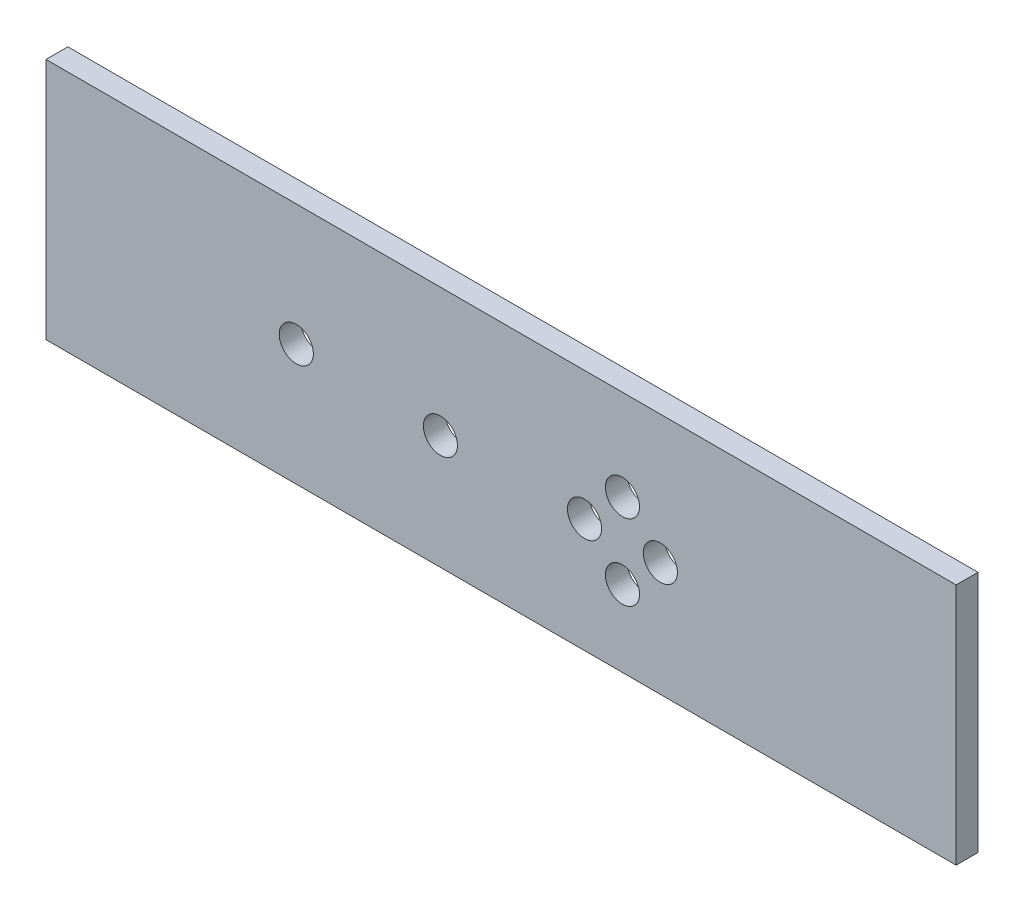
ISO-10303-21;
HEADER;
FILE_DESCRIPTION(('STEP AP214'),'2;1');
FILE_NAME('part.step','',(''),(''),'','','');
FILE_SCHEMA(('AUTOMOTIVE_DESIGN { 1 0 10303 214 1 1 1 1 }'));
ENDSEC;
DATA;
#1=APPLICATION_CONTEXT('core data for automotive mechanical design processes');
#2=APPLICATION_PROTOCOL_DEFINITION('international standard','automotive_design',2000,#1);
#3=PRODUCT_CONTEXT('',#1,'mechanical');
#4=PRODUCT('Part','Part','',(#3));
#5=PRODUCT_RELATED_PRODUCT_CATEGORY('part','',(#4));
#6=PRODUCT_DEFINITION_FORMATION('','',#4);
#7=PRODUCT_DEFINITION_CONTEXT('part definition',#1,'design');
#8=PRODUCT_DEFINITION('design','',#6,#7);
#9=PRODUCT_DEFINITION_SHAPE('','',#8);
#10=(LENGTH_UNIT() NAMED_UNIT(*) SI_UNIT(.MILLI.,.METRE.));
#11=(NAMED_UNIT(*) PLANE_ANGLE_UNIT() SI_UNIT($,.RADIAN.));
#12=(NAMED_UNIT(*) SI_UNIT($,.STERADIAN.) SOLID_ANGLE_UNIT());
#13=UNCERTAINTY_MEASURE_WITH_UNIT(LENGTH_MEASURE(1.E-05),#10,'distance_accuracy_value','');
#14=(GEOMETRIC_REPRESENTATION_CONTEXT(3) GLOBAL_UNCERTAINTY_ASSIGNED_CONTEXT((#13)) GLOBAL_UNIT_ASSIGNED_CONTEXT((#10,
#11,#12)) REPRESENTATION_CONTEXT('',''));
#15=CARTESIAN_POINT('',(0.,0.,0.));
#16=DIRECTION('',(0.,0.,1.));
#17=DIRECTION('',(1.,0.,0.));
#18=AXIS2_PLACEMENT_3D('',#15,#16,#17);
#19=CARTESIAN_POINT('',(-322.443113772455,234.22754491018,18.288));
#20=DIRECTION('',(1.,0.,0.));
#21=DIRECTION('',(0.,0.,-1.));
#22=AXIS2_PLACEMENT_3D('',#19,#20,#21);
#23=PLANE('',#22);
#24=DIRECTION('',(0.,-1.,0.));
#25=VECTOR('',#24,1.);
#26=CARTESIAN_POINT('',(-322.443113772455,234.22754491018,0.));
#27=LINE('',#26,#25);
#28=CARTESIAN_POINT('',(-322.443113772455,234.22754491018,0.));
#29=VERTEX_POINT('',#28);
#30=CARTESIAN_POINT('',(-322.443113772455,31.0275449101796,0.));
#31=VERTEX_POINT('',#30);
#32=EDGE_CURVE('E100',#29,#31,#27,.T.);
#33=ORIENTED_EDGE('',*,*,#32,.T.);
#34=DIRECTION('',(0.,0.,-1.));
#35=VECTOR('',#34,1.);
#36=CARTESIAN_POINT('',(-322.443113772455,31.0275449101796,18.288));
#37=LINE('',#36,#35);
#38=CARTESIAN_POINT('',(-322.443113772455,31.0275449101796,18.288));
#39=VERTEX_POINT('',#38);
#40=EDGE_CURVE('E11',#39,#31,#37,.T.);
#41=ORIENTED_EDGE('',*,*,#40,.F.);
#42=DIRECTION('',(0.,-1.,0.));
#43=VECTOR('',#42,1.);
#44=CARTESIAN_POINT('',(-322.443113772455,234.22754491018,18.288));
#45=LINE('',#44,#43);
#46=CARTESIAN_POINT('',(-322.443113772455,234.22754491018,18.288));
#47=VERTEX_POINT('',#46);
#48=EDGE_CURVE('E88',#47,#39,#45,.T.);
#49=ORIENTED_EDGE('',*,*,#48,.F.);
#50=DIRECTION('',(0.,0.,-1.));
#51=VECTOR('',#50,1.);
#52=CARTESIAN_POINT('',(-322.443113772455,234.22754491018,18.288));
#53=LINE('',#52,#51);
#54=EDGE_CURVE('E96',#47,#29,#53,.T.);
#55=ORIENTED_EDGE('',*,*,#54,.T.);
#56=EDGE_LOOP('',(#33,#41,#49,#55));
#57=FACE_BOUND('',#56,.T.);
#58=ADVANCED_FACE('F37',(#57),#23,.F.);
#59=CARTESIAN_POINT('',(-322.443113772455,31.0275449101796,18.288));
#60=DIRECTION('',(0.,1.,0.));
#61=DIRECTION('',(0.,0.,1.));
#62=AXIS2_PLACEMENT_3D('',#59,#60,#61);
#63=PLANE('',#62);
#64=DIRECTION('',(1.,0.,0.));
#65=VECTOR('',#64,1.);
#66=CARTESIAN_POINT('',(-322.443113772455,31.0275449101796,0.));
#67=LINE('',#66,#65);
#68=CARTESIAN_POINT('',(439.556886227545,31.0275449101796,0.));
#69=VERTEX_POINT('',#68);
#70=EDGE_CURVE('E92',#31,#69,#67,.T.);
#71=ORIENTED_EDGE('',*,*,#70,.T.);
#72=DIRECTION('',(0.,0.,-1.));
#73=VECTOR('',#72,1.);
#74=CARTESIAN_POINT('',(439.556886227545,31.0275449101796,18.288));
#75=LINE('',#74,#73);
#76=CARTESIAN_POINT('',(439.556886227545,31.0275449101796,18.288));
#77=VERTEX_POINT('',#76);
#78=EDGE_CURVE('E45',#77,#69,#75,.T.);
#79=ORIENTED_EDGE('',*,*,#78,.F.);
#80=DIRECTION('',(1.,0.,0.));
#81=VECTOR('',#80,1.);
#82=CARTESIAN_POINT('',(-322.443113772455,31.0275449101796,18.288));
#83=LINE('',#82,#81);
#84=EDGE_CURVE('E83',#39,#77,#83,.T.);
#85=ORIENTED_EDGE('',*,*,#84,.F.);
#86=ORIENTED_EDGE('',*,*,#40,.T.);
#87=EDGE_LOOP('',(#71,#79,#85,#86));
#88=FACE_BOUND('',#87,.T.);
#89=ADVANCED_FACE('F91',(#88),#63,.F.);
#90=CARTESIAN_POINT('',(439.556886227545,234.22754491018,18.288));
#91=DIRECTION('',(-1.,0.,0.));
#92=DIRECTION('',(0.,-1.,0.));
#93=AXIS2_PLACEMENT_3D('',#90,#91,#92);
#94=PLANE('',#93);
#95=DIRECTION('',(0.,1.,0.));
#96=VECTOR('',#95,1.);
#97=CARTESIAN_POINT('',(439.556886227545,234.22754491018,0.));
#98=LINE('',#97,#96);
#99=CARTESIAN_POINT('',(439.556886227545,234.22754491018,0.));
#100=VERTEX_POINT('',#99);
#101=EDGE_CURVE('E70',#69,#100,#98,.T.);
#102=ORIENTED_EDGE('',*,*,#101,.T.);
#103=DIRECTION('',(0.,0.,-1.));
#104=VECTOR('',#103,1.);
#105=CARTESIAN_POINT('',(439.556886227545,234.22754491018,18.288));
#106=LINE('',#105,#104);
#107=CARTESIAN_POINT('',(439.556886227545,234.22754491018,18.288));
#108=VERTEX_POINT('',#107);
#109=EDGE_CURVE('E93',#108,#100,#106,.T.);
#110=ORIENTED_EDGE('',*,*,#109,.F.);
#111=DIRECTION('',(0.,1.,0.));
#112=VECTOR('',#111,1.);
#113=CARTESIAN_POINT('',(439.556886227545,234.22754491018,18.288));
#114=LINE('',#113,#112);
#115=EDGE_CURVE('E86',#77,#108,#114,.T.);
#116=ORIENTED_EDGE('',*,*,#115,.F.);
#117=ORIENTED_EDGE('',*,*,#78,.T.);
#118=EDGE_LOOP('',(#102,#110,#116,#117));
#119=FACE_BOUND('',#118,.T.);
#120=ADVANCED_FACE('F94',(#119),#94,.F.);
#121=CARTESIAN_POINT('',(-322.443113772455,234.22754491018,18.288));
#122=DIRECTION('',(0.,-1.,0.));
#123=DIRECTION('',(0.,0.,-1.));
#124=AXIS2_PLACEMENT_3D('',#121,#122,#123);
#125=PLANE('',#124);
#126=DIRECTION('',(-1.,0.,0.));
#127=VECTOR('',#126,1.);
#128=CARTESIAN_POINT('',(-322.443113772455,234.22754491018,0.));
#129=LINE('',#128,#127);
#130=EDGE_CURVE('E76',#100,#29,#129,.T.);
#131=ORIENTED_EDGE('',*,*,#130,.T.);
#132=ORIENTED_EDGE('',*,*,#54,.F.);
#133=DIRECTION('',(-1.,0.,0.));
#134=VECTOR('',#133,1.);
#135=CARTESIAN_POINT('',(-322.443113772455,234.22754491018,18.288));
#136=LINE('',#135,#134);
#137=EDGE_CURVE('E53',#108,#47,#136,.T.);
#138=ORIENTED_EDGE('',*,*,#137,.F.);
#139=ORIENTED_EDGE('',*,*,#109,.T.);
#140=EDGE_LOOP('',(#131,#132,#138,#139));
#141=FACE_BOUND('',#140,.T.);
#142=ADVANCED_FACE('F108',(#141),#125,.F.);
#143=CARTESIAN_POINT('',(0.,0.,18.288));
#144=DIRECTION('',(0.,0.,1.));
#145=DIRECTION('',(1.,0.,0.));
#146=AXIS2_PLACEMENT_3D('',#143,#144,#145);
#147=PLANE('',#146);
#148=CARTESIAN_POINT('',(191.906886227545,126.576648331846,18.288));
#149=DIRECTION('',(0.,0.,-1.));
#150=DIRECTION('',(-1.,0.,0.));
#151=AXIS2_PLACEMENT_3D('',#148,#149,#150);
#152=CIRCLE('',#151,14.2875);
#153=CARTESIAN_POINT('',(177.619386227545,126.576648331846,18.288));
#154=VERTEX_POINT('',#153);
#155=EDGE_CURVE('E123',#154,#154,#152,.T.);
#156=ORIENTED_EDGE('',*,*,#155,.T.);
#157=EDGE_LOOP('',(#156));
#158=FACE_BOUND('',#157,.T.);
#159=CARTESIAN_POINT('',(160.156886227545,158.326648331846,18.288));
#160=DIRECTION('',(0.,0.,-1.));
#161=DIRECTION('',(-1.,0.,0.));
#162=AXIS2_PLACEMENT_3D('',#159,#160,#161);
#163=CIRCLE('',#162,14.2875);
#164=CARTESIAN_POINT('',(145.869386227545,158.326648331846,18.288));
#165=VERTEX_POINT('',#164);
#166=EDGE_CURVE('E129',#165,#165,#163,.T.);
#167=ORIENTED_EDGE('',*,*,#166,.T.);
#168=EDGE_LOOP('',(#167));
#169=FACE_BOUND('',#168,.T.);
#170=CARTESIAN_POINT('',(160.156886227545,94.8266483318463,18.288));
#171=DIRECTION('',(0.,0.,-1.));
#172=DIRECTION('',(-1.,0.,0.));
#173=AXIS2_PLACEMENT_3D('',#170,#171,#172);
#174=CIRCLE('',#173,14.2875);
#175=CARTESIAN_POINT('',(145.869386227545,94.8266483318463,18.288));
#176=VERTEX_POINT('',#175);
#177=EDGE_CURVE('E130',#176,#176,#174,.T.);
#178=ORIENTED_EDGE('',*,*,#177,.T.);
#179=EDGE_LOOP('',(#178));
#180=FACE_BOUND('',#179,.T.);
#181=CARTESIAN_POINT('',(7.75688622754495,126.576648331846,18.288));
#182=DIRECTION('',(0.,0.,-1.));
#183=DIRECTION('',(-1.,0.,0.));
#184=AXIS2_PLACEMENT_3D('',#181,#182,#183);
#185=CIRCLE('',#184,14.2875);
#186=CARTESIAN_POINT('',(-6.53061377245506,126.576648331846,18.288));
#187=VERTEX_POINT('',#186);
#188=EDGE_CURVE('E141',#187,#187,#185,.T.);
#189=ORIENTED_EDGE('',*,*,#188,.T.);
#190=EDGE_LOOP('',(#189));
#191=FACE_BOUND('',#190,.T.);
#192=CARTESIAN_POINT('',(128.406886227545,126.576648331846,18.288));
#193=DIRECTION('',(0.,0.,-1.));
#194=DIRECTION('',(-1.,0.,0.));
#195=AXIS2_PLACEMENT_3D('',#192,#193,#194);
#196=CIRCLE('',#195,14.2875);
#197=CARTESIAN_POINT('',(114.119386227545,126.576648331846,18.288));
#198=VERTEX_POINT('',#197);
#199=EDGE_CURVE('E117',#198,#198,#196,.T.);
#200=ORIENTED_EDGE('',*,*,#199,.T.);
#201=EDGE_LOOP('',(#200));
#202=FACE_BOUND('',#201,.T.);
#203=CARTESIAN_POINT('',(-112.893113772455,132.62754491018,18.288));
#204=DIRECTION('',(0.,0.,-1.));
#205=DIRECTION('',(-1.,0.,0.));
#206=AXIS2_PLACEMENT_3D('',#203,#204,#205);
#207=CIRCLE('',#206,14.2875);
#208=CARTESIAN_POINT('',(-127.180613772455,132.62754491018,18.288));
#209=VERTEX_POINT('',#208);
#210=EDGE_CURVE('E103',#209,#209,#207,.T.);
#211=ORIENTED_EDGE('',*,*,#210,.T.);
#212=EDGE_LOOP('',(#211));
#213=FACE_BOUND('',#212,.T.);
#214=ORIENTED_EDGE('',*,*,#48,.T.);
#215=ORIENTED_EDGE('',*,*,#84,.T.);
#216=ORIENTED_EDGE('',*,*,#115,.T.);
#217=ORIENTED_EDGE('',*,*,#137,.T.);
#218=EDGE_LOOP('',(#214,#215,#216,#217));
#219=FACE_BOUND('',#218,.T.);
#220=ADVANCED_FACE('F84',(#158,#169,#180,#191,#202,#213,#219),#147,.T.);
#221=CARTESIAN_POINT('',(0.,0.,0.));
#222=DIRECTION('',(0.,0.,1.));
#223=DIRECTION('',(1.,0.,0.));
#224=AXIS2_PLACEMENT_3D('',#221,#222,#223);
#225=PLANE('',#224);
#226=CARTESIAN_POINT('',(191.906886227545,126.576648331846,0.));
#227=DIRECTION('',(0.,0.,-1.));
#228=DIRECTION('',(-1.,0.,0.));
#229=AXIS2_PLACEMENT_3D('',#226,#227,#228);
#230=CIRCLE('',#229,14.2875);
#231=CARTESIAN_POINT('',(177.619386227545,126.576648331846,0.));
#232=VERTEX_POINT('',#231);
#233=EDGE_CURVE('E133',#232,#232,#230,.T.);
#234=ORIENTED_EDGE('',*,*,#233,.F.);
#235=EDGE_LOOP('',(#234));
#236=FACE_BOUND('',#235,.T.);
#237=CARTESIAN_POINT('',(160.156886227545,158.326648331846,0.));
#238=DIRECTION('',(0.,0.,-1.));
#239=DIRECTION('',(-1.,0.,0.));
#240=AXIS2_PLACEMENT_3D('',#237,#238,#239);
#241=CIRCLE('',#240,14.2875);
#242=CARTESIAN_POINT('',(145.869386227545,158.326648331846,0.));
#243=VERTEX_POINT('',#242);
#244=EDGE_CURVE('E126',#243,#243,#241,.T.);
#245=ORIENTED_EDGE('',*,*,#244,.F.);
#246=EDGE_LOOP('',(#245));
#247=FACE_BOUND('',#246,.T.);
#248=CARTESIAN_POINT('',(160.156886227545,94.8266483318463,0.));
#249=DIRECTION('',(0.,0.,-1.));
#250=DIRECTION('',(-1.,0.,0.));
#251=AXIS2_PLACEMENT_3D('',#248,#249,#250);
#252=CIRCLE('',#251,14.2875);
#253=CARTESIAN_POINT('',(145.869386227545,94.8266483318463,0.));
#254=VERTEX_POINT('',#253);
#255=EDGE_CURVE('E144',#254,#254,#252,.T.);
#256=ORIENTED_EDGE('',*,*,#255,.F.);
#257=EDGE_LOOP('',(#256));
#258=FACE_BOUND('',#257,.T.);
#259=CARTESIAN_POINT('',(7.75688622754495,126.576648331846,0.));
#260=DIRECTION('',(0.,0.,-1.));
#261=DIRECTION('',(-1.,0.,0.));
#262=AXIS2_PLACEMENT_3D('',#259,#260,#261);
#263=CIRCLE('',#262,14.2875);
#264=CARTESIAN_POINT('',(-6.53061377245506,126.576648331846,0.));
#265=VERTEX_POINT('',#264);
#266=EDGE_CURVE('E138',#265,#265,#263,.T.);
#267=ORIENTED_EDGE('',*,*,#266,.F.);
#268=EDGE_LOOP('',(#267));
#269=FACE_BOUND('',#268,.T.);
#270=CARTESIAN_POINT('',(128.406886227545,126.576648331846,0.));
#271=DIRECTION('',(0.,0.,-1.));
#272=DIRECTION('',(-1.,0.,0.));
#273=AXIS2_PLACEMENT_3D('',#270,#271,#272);
#274=CIRCLE('',#273,14.2875);
#275=CARTESIAN_POINT('',(114.119386227545,126.576648331846,0.));
#276=VERTEX_POINT('',#275);
#277=EDGE_CURVE('E120',#276,#276,#274,.T.);
#278=ORIENTED_EDGE('',*,*,#277,.F.);
#279=EDGE_LOOP('',(#278));
#280=FACE_BOUND('',#279,.T.);
#281=CARTESIAN_POINT('',(-112.893113772455,132.62754491018,0.));
#282=DIRECTION('',(0.,0.,-1.));
#283=DIRECTION('',(-1.,0.,0.));
#284=AXIS2_PLACEMENT_3D('',#281,#282,#283);
#285=CIRCLE('',#284,14.2875);
#286=CARTESIAN_POINT('',(-127.180613772455,132.62754491018,0.));
#287=VERTEX_POINT('',#286);
#288=EDGE_CURVE('E114',#287,#287,#285,.T.);
#289=ORIENTED_EDGE('',*,*,#288,.F.);
#290=EDGE_LOOP('',(#289));
#291=FACE_BOUND('',#290,.T.);
#292=ORIENTED_EDGE('',*,*,#32,.F.);
#293=ORIENTED_EDGE('',*,*,#130,.F.);
#294=ORIENTED_EDGE('',*,*,#101,.F.);
#295=ORIENTED_EDGE('',*,*,#70,.F.);
#296=EDGE_LOOP('',(#292,#293,#294,#295));
#297=FACE_BOUND('',#296,.T.);
#298=ADVANCED_FACE('F111',(#236,#247,#258,#269,#280,#291,#297),#225,.F.);
#299=CARTESIAN_POINT('',(-112.893113772455,132.62754491018,18.288));
#300=DIRECTION('',(0.,0.,-1.));
#301=DIRECTION('',(-1.,0.,0.));
#302=AXIS2_PLACEMENT_3D('',#299,#300,#301);
#303=CYLINDRICAL_SURFACE('',#302,14.2875);
#304=ORIENTED_EDGE('',*,*,#210,.F.);
#305=EDGE_LOOP('',(#304));
#306=FACE_BOUND('',#305,.T.);
#307=ORIENTED_EDGE('',*,*,#288,.T.);
#308=EDGE_LOOP('',(#307));
#309=FACE_BOUND('',#308,.T.);
#310=ADVANCED_FACE('F162',(#306,#309),#303,.F.);
#311=CARTESIAN_POINT('',(128.406886227545,126.576648331846,18.288));
#312=DIRECTION('',(0.,0.,-1.));
#313=DIRECTION('',(-1.,0.,0.));
#314=AXIS2_PLACEMENT_3D('',#311,#312,#313);
#315=CYLINDRICAL_SURFACE('',#314,14.2875);
#316=ORIENTED_EDGE('',*,*,#199,.F.);
#317=EDGE_LOOP('',(#316));
#318=FACE_BOUND('',#317,.T.);
#319=ORIENTED_EDGE('',*,*,#277,.T.);
#320=EDGE_LOOP('',(#319));
#321=FACE_BOUND('',#320,.T.);
#322=ADVANCED_FACE('F172',(#318,#321),#315,.F.);
#323=CARTESIAN_POINT('',(7.75688622754495,126.576648331846,18.288));
#324=DIRECTION('',(0.,0.,-1.));
#325=DIRECTION('',(-1.,0.,0.));
#326=AXIS2_PLACEMENT_3D('',#323,#324,#325);
#327=CYLINDRICAL_SURFACE('',#326,14.2875);
#328=ORIENTED_EDGE('',*,*,#188,.F.);
#329=EDGE_LOOP('',(#328));
#330=FACE_BOUND('',#329,.T.);
#331=ORIENTED_EDGE('',*,*,#266,.T.);
#332=EDGE_LOOP('',(#331));
#333=FACE_BOUND('',#332,.T.);
#334=ADVANCED_FACE('F156',(#330,#333),#327,.F.);
#335=CARTESIAN_POINT('',(160.156886227545,94.8266483318463,18.288));
#336=DIRECTION('',(0.,0.,-1.));
#337=DIRECTION('',(-1.,0.,0.));
#338=AXIS2_PLACEMENT_3D('',#335,#336,#337);
#339=CYLINDRICAL_SURFACE('',#338,14.2875);
#340=ORIENTED_EDGE('',*,*,#177,.F.);
#341=EDGE_LOOP('',(#340));
#342=FACE_BOUND('',#341,.T.);
#343=ORIENTED_EDGE('',*,*,#255,.T.);
#344=EDGE_LOOP('',(#343));
#345=FACE_BOUND('',#344,.T.);
#346=ADVANCED_FACE('F152',(#342,#345),#339,.F.);
#347=CARTESIAN_POINT('',(160.156886227545,158.326648331846,18.288));
#348=DIRECTION('',(0.,0.,-1.));
#349=DIRECTION('',(-1.,0.,0.));
#350=AXIS2_PLACEMENT_3D('',#347,#348,#349);
#351=CYLINDRICAL_SURFACE('',#350,14.2875);
#352=ORIENTED_EDGE('',*,*,#166,.F.);
#353=EDGE_LOOP('',(#352));
#354=FACE_BOUND('',#353,.T.);
#355=ORIENTED_EDGE('',*,*,#244,.T.);
#356=EDGE_LOOP('',(#355));
#357=FACE_BOUND('',#356,.T.);
#358=ADVANCED_FACE('F155',(#354,#357),#351,.F.);
#359=CARTESIAN_POINT('',(191.906886227545,126.576648331846,18.288));
#360=DIRECTION('',(0.,0.,-1.));
#361=DIRECTION('',(-1.,0.,0.));
#362=AXIS2_PLACEMENT_3D('',#359,#360,#361);
#363=CYLINDRICAL_SURFACE('',#362,14.2875);
#364=ORIENTED_EDGE('',*,*,#155,.F.);
#365=EDGE_LOOP('',(#364));
#366=FACE_BOUND('',#365,.T.);
#367=ORIENTED_EDGE('',*,*,#233,.T.);
#368=EDGE_LOOP('',(#367));
#369=FACE_BOUND('',#368,.T.);
#370=ADVANCED_FACE('F202',(#366,#369),#363,.F.);
#371=CLOSED_SHELL('',(#58,#89,#120,#142,#220,#298,#310,#322,#334,#346,#358,#370));
#372=MANIFOLD_SOLID_BREP('B2',#371);
#373=ADVANCED_BREP_SHAPE_REPRESENTATION('',(#18,#372),#14);
#374=SHAPE_DEFINITION_REPRESENTATION(#9,#373);
ENDSEC;
END-ISO-10303-21;
